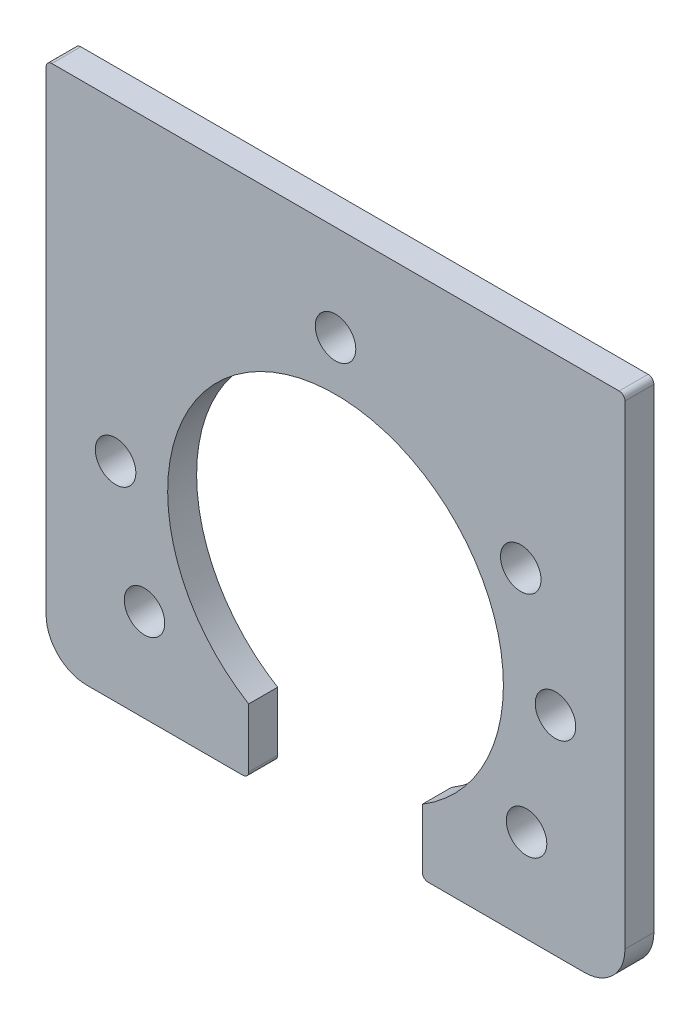
ISO-10303-21;
HEADER;
FILE_DESCRIPTION(('STEP AP214'),'2;1');
FILE_NAME('part.step','',(''),(''),'','','');
FILE_SCHEMA(('AUTOMOTIVE_DESIGN { 1 0 10303 214 1 1 1 1 }'));
ENDSEC;
DATA;
#1=APPLICATION_CONTEXT('core data for automotive mechanical design processes');
#2=APPLICATION_PROTOCOL_DEFINITION('international standard','automotive_design',2000,#1);
#3=PRODUCT_CONTEXT('',#1,'mechanical');
#4=PRODUCT('Part','Part','',(#3));
#5=PRODUCT_RELATED_PRODUCT_CATEGORY('part','',(#4));
#6=PRODUCT_DEFINITION_FORMATION('','',#4);
#7=PRODUCT_DEFINITION_CONTEXT('part definition',#1,'design');
#8=PRODUCT_DEFINITION('design','',#6,#7);
#9=PRODUCT_DEFINITION_SHAPE('','',#8);
#10=(LENGTH_UNIT() NAMED_UNIT(*) SI_UNIT(.MILLI.,.METRE.));
#11=(NAMED_UNIT(*) PLANE_ANGLE_UNIT() SI_UNIT($,.RADIAN.));
#12=(NAMED_UNIT(*) SI_UNIT($,.STERADIAN.) SOLID_ANGLE_UNIT());
#13=UNCERTAINTY_MEASURE_WITH_UNIT(LENGTH_MEASURE(1.E-05),#10,'distance_accuracy_value','');
#14=(GEOMETRIC_REPRESENTATION_CONTEXT(3) GLOBAL_UNCERTAINTY_ASSIGNED_CONTEXT((#13)) GLOBAL_UNIT_ASSIGNED_CONTEXT((#10,
#11,#12)) REPRESENTATION_CONTEXT('',''));
#15=CARTESIAN_POINT('',(0.,0.,0.));
#16=DIRECTION('',(0.,0.,1.));
#17=DIRECTION('',(1.,0.,0.));
#18=AXIS2_PLACEMENT_3D('',#15,#16,#17);
#19=CARTESIAN_POINT('',(-93.0000000000001,-83.0000000000001,5.));
#20=DIRECTION('',(0.,0.,-1.));
#21=DIRECTION('',(-1.,0.,0.));
#22=AXIS2_PLACEMENT_3D('',#19,#20,#21);
#23=PLANE('',#22);
#24=CARTESIAN_POINT('',(-83.0000000000002,-74.0000000000001,5.));
#25=DIRECTION('',(0.,0.,1.));
#26=DIRECTION('',(-1.,0.,0.));
#27=AXIS2_PLACEMENT_3D('',#24,#25,#26);
#28=CIRCLE('',#27,3.49999999999999);
#29=CARTESIAN_POINT('',(-86.5000000000002,-74.0000000000001,5.));
#30=VERTEX_POINT('',#29);
#31=EDGE_CURVE('E496',#30,#30,#28,.T.);
#32=ORIENTED_EDGE('',*,*,#31,.F.);
#33=EDGE_LOOP('',(#32));
#34=FACE_BOUND('',#33,.T.);
#35=CARTESIAN_POINT('',(-18.0000000000001,-35.,5.));
#36=DIRECTION('',(0.,0.,1.));
#37=DIRECTION('',(1.,0.,0.));
#38=AXIS2_PLACEMENT_3D('',#35,#36,#37);
#39=CIRCLE('',#38,3.5);
#40=CARTESIAN_POINT('',(-14.5000000000001,-35.,5.));
#41=VERTEX_POINT('',#40);
#42=EDGE_CURVE('E508',#41,#41,#39,.T.);
#43=ORIENTED_EDGE('',*,*,#42,.F.);
#44=EDGE_LOOP('',(#43));
#45=FACE_BOUND('',#44,.T.);
#46=CARTESIAN_POINT('',(-50.0000000000001,-16.5,5.));
#47=DIRECTION('',(0.,0.,1.));
#48=DIRECTION('',(1.,0.,0.));
#49=AXIS2_PLACEMENT_3D('',#46,#47,#48);
#50=CIRCLE('',#49,3.5);
#51=CARTESIAN_POINT('',(-46.5000000000001,-16.5,5.));
#52=VERTEX_POINT('',#51);
#53=EDGE_CURVE('E182',#52,#52,#50,.T.);
#54=ORIENTED_EDGE('',*,*,#53,.F.);
#55=EDGE_LOOP('',(#54));
#56=FACE_BOUND('',#55,.T.);
#57=DIRECTION('',(0.,-1.,0.));
#58=VECTOR('',#57,1.);
#59=CARTESIAN_POINT('',(-35.0000000000001,-78.8193472919817,5.));
#60=LINE('',#59,#58);
#61=CARTESIAN_POINT('',(-35.0000000000001,-78.8193472919817,5.));
#62=VERTEX_POINT('',#61);
#63=CARTESIAN_POINT('',(-35.0000000000001,-88.9999999999993,5.));
#64=VERTEX_POINT('',#63);
#65=EDGE_CURVE('E160',#62,#64,#60,.T.);
#66=ORIENTED_EDGE('',*,*,#65,.T.);
#67=CARTESIAN_POINT('',(-34.0000000000001,-88.9999999999993,5.));
#68=DIRECTION('',(0.,0.,-1.));
#69=DIRECTION('',(-1.,0.,0.));
#70=AXIS2_PLACEMENT_3D('',#67,#68,#69);
#71=CIRCLE('',#70,1.);
#72=CARTESIAN_POINT('',(-34.0000000000001,-90.,5.));
#73=VERTEX_POINT('',#72);
#74=EDGE_CURVE('E11',#64,#73,#71,.F.);
#75=ORIENTED_EDGE('',*,*,#74,.T.);
#76=DIRECTION('',(1.,0.,0.));
#77=VECTOR('',#76,1.);
#78=CARTESIAN_POINT('',(-35.0000000000001,-90.,5.));
#79=LINE('',#78,#77);
#80=CARTESIAN_POINT('',(-7.00000000000014,-90.0000000000001,5.));
#81=VERTEX_POINT('',#80);
#82=EDGE_CURVE('E162',#73,#81,#79,.T.);
#83=ORIENTED_EDGE('',*,*,#82,.T.);
#84=CARTESIAN_POINT('',(-7.00000000000009,-83.0000000000001,5.));
#85=DIRECTION('',(0.,0.,1.));
#86=DIRECTION('',(1.,0.,0.));
#87=AXIS2_PLACEMENT_3D('',#84,#85,#86);
#88=CIRCLE('',#87,7.00000000000001);
#89=CARTESIAN_POINT('',(0.,-83.,5.));
#90=VERTEX_POINT('',#89);
#91=EDGE_CURVE('E167',#81,#90,#88,.T.);
#92=ORIENTED_EDGE('',*,*,#91,.T.);
#93=DIRECTION('',(0.,1.,0.));
#94=VECTOR('',#93,1.);
#95=CARTESIAN_POINT('',(0.,-80.0000000000001,5.));
#96=LINE('',#95,#94);
#97=CARTESIAN_POINT('',(2.96059473233382E-13,-1.00000000000006,5.));
#98=VERTEX_POINT('',#97);
#99=EDGE_CURVE('E169',#90,#98,#96,.T.);
#100=ORIENTED_EDGE('',*,*,#99,.T.);
#101=CARTESIAN_POINT('',(-0.999999999999974,-1.00000000000006,5.));
#102=DIRECTION('',(0.,0.,-1.));
#103=DIRECTION('',(-1.,0.,0.));
#104=AXIS2_PLACEMENT_3D('',#101,#102,#103);
#105=CIRCLE('',#104,1.);
#106=CARTESIAN_POINT('',(-0.999999999999974,0.,5.));
#107=VERTEX_POINT('',#106);
#108=EDGE_CURVE('E232',#98,#107,#105,.F.);
#109=ORIENTED_EDGE('',*,*,#108,.T.);
#110=DIRECTION('',(-1.,0.,0.));
#111=VECTOR('',#110,1.);
#112=CARTESIAN_POINT('',(0.,0.,5.));
#113=LINE('',#112,#111);
#114=CARTESIAN_POINT('',(-99.0000000000005,0.,5.));
#115=VERTEX_POINT('',#114);
#116=EDGE_CURVE('E172',#107,#115,#113,.T.);
#117=ORIENTED_EDGE('',*,*,#116,.T.);
#118=CARTESIAN_POINT('',(-99.0000000000005,-1.00000000000006,5.));
#119=DIRECTION('',(0.,0.,-1.));
#120=DIRECTION('',(-1.,0.,0.));
#121=AXIS2_PLACEMENT_3D('',#118,#119,#120);
#122=CIRCLE('',#121,1.);
#123=CARTESIAN_POINT('',(-100.,-1.00000000000006,5.));
#124=VERTEX_POINT('',#123);
#125=EDGE_CURVE('E223',#115,#124,#122,.F.);
#126=ORIENTED_EDGE('',*,*,#125,.T.);
#127=DIRECTION('',(0.,-1.,0.));
#128=VECTOR('',#127,1.);
#129=CARTESIAN_POINT('',(-100.,0.,5.));
#130=LINE('',#129,#128);
#131=CARTESIAN_POINT('',(-100.,-83.,5.));
#132=VERTEX_POINT('',#131);
#133=EDGE_CURVE('E174',#124,#132,#130,.T.);
#134=ORIENTED_EDGE('',*,*,#133,.T.);
#135=CARTESIAN_POINT('',(-93.0000000000001,-83.0000000000001,5.));
#136=DIRECTION('',(0.,0.,1.));
#137=DIRECTION('',(-1.,0.,0.));
#138=AXIS2_PLACEMENT_3D('',#135,#136,#137);
#139=CIRCLE('',#138,7.00000000000001);
#140=CARTESIAN_POINT('',(-93.,-90.0000000000001,5.));
#141=VERTEX_POINT('',#140);
#142=EDGE_CURVE('E176',#132,#141,#139,.T.);
#143=ORIENTED_EDGE('',*,*,#142,.T.);
#144=DIRECTION('',(1.,0.,0.));
#145=VECTOR('',#144,1.);
#146=CARTESIAN_POINT('',(-65.0000000000001,-90.,5.));
#147=LINE('',#146,#145);
#148=CARTESIAN_POINT('',(-66.0000000000001,-90.,5.));
#149=VERTEX_POINT('',#148);
#150=EDGE_CURVE('E146',#141,#149,#147,.T.);
#151=ORIENTED_EDGE('',*,*,#150,.T.);
#152=CARTESIAN_POINT('',(-66.0000000000001,-88.9999999999993,5.));
#153=DIRECTION('',(0.,0.,-1.));
#154=DIRECTION('',(-1.,0.,0.));
#155=AXIS2_PLACEMENT_3D('',#152,#153,#154);
#156=CIRCLE('',#155,1.);
#157=CARTESIAN_POINT('',(-65.0000000000001,-88.9999999999993,5.));
#158=VERTEX_POINT('',#157);
#159=EDGE_CURVE('E142',#149,#158,#156,.F.);
#160=ORIENTED_EDGE('',*,*,#159,.T.);
#161=DIRECTION('',(0.,1.,0.));
#162=VECTOR('',#161,1.);
#163=CARTESIAN_POINT('',(-65.0000000000001,-78.8193472919817,5.));
#164=LINE('',#163,#162);
#165=CARTESIAN_POINT('',(-65.0000000000001,-78.8193472919817,5.));
#166=VERTEX_POINT('',#165);
#167=EDGE_CURVE('E134',#158,#166,#164,.T.);
#168=ORIENTED_EDGE('',*,*,#167,.T.);
#169=CARTESIAN_POINT('',(-50.0000000000001,-54.,5.));
#170=DIRECTION('',(0.,0.,-1.));
#171=DIRECTION('',(1.,0.,0.));
#172=AXIS2_PLACEMENT_3D('',#169,#170,#171);
#173=CIRCLE('',#172,29.);
#174=EDGE_CURVE('E138',#166,#62,#173,.T.);
#175=ORIENTED_EDGE('',*,*,#174,.T.);
#176=EDGE_LOOP('',(#66,#75,#83,#92,#100,#109,#117,#126,#134,#143,#151,#160,#168,#175));
#177=FACE_BOUND('',#176,.T.);
#178=CARTESIAN_POINT('',(-12.,-54.,5.));
#179=DIRECTION('',(0.,0.,1.));
#180=DIRECTION('',(1.,0.,0.));
#181=AXIS2_PLACEMENT_3D('',#178,#179,#180);
#182=CIRCLE('',#181,3.5);
#183=CARTESIAN_POINT('',(-8.49999999999996,-54.,5.));
#184=VERTEX_POINT('',#183);
#185=EDGE_CURVE('E514',#184,#184,#182,.T.);
#186=ORIENTED_EDGE('',*,*,#185,.F.);
#187=EDGE_LOOP('',(#186));
#188=FACE_BOUND('',#187,.T.);
#189=CARTESIAN_POINT('',(-17.,-74.0000000000001,5.));
#190=DIRECTION('',(0.,0.,1.));
#191=DIRECTION('',(1.,0.,0.));
#192=AXIS2_PLACEMENT_3D('',#189,#190,#191);
#193=CIRCLE('',#192,3.5);
#194=CARTESIAN_POINT('',(-13.5,-74.0000000000001,5.));
#195=VERTEX_POINT('',#194);
#196=EDGE_CURVE('E502',#195,#195,#193,.T.);
#197=ORIENTED_EDGE('',*,*,#196,.F.);
#198=EDGE_LOOP('',(#197));
#199=FACE_BOUND('',#198,.T.);
#200=CARTESIAN_POINT('',(-88.0000000000002,-54.,5.));
#201=DIRECTION('',(0.,0.,1.));
#202=DIRECTION('',(-1.,0.,0.));
#203=AXIS2_PLACEMENT_3D('',#200,#201,#202);
#204=CIRCLE('',#203,3.50000000000001);
#205=CARTESIAN_POINT('',(-91.5000000000002,-54.,5.));
#206=VERTEX_POINT('',#205);
#207=EDGE_CURVE('E487',#206,#206,#204,.T.);
#208=ORIENTED_EDGE('',*,*,#207,.F.);
#209=EDGE_LOOP('',(#208));
#210=FACE_BOUND('',#209,.T.);
#211=ADVANCED_FACE('F34',(#34,#45,#56,#177,#188,#199,#210),#23,.F.);
#212=CARTESIAN_POINT('',(-93.0000000000001,-83.0000000000001,0.));
#213=DIRECTION('',(0.,0.,-1.));
#214=DIRECTION('',(-1.,0.,0.));
#215=AXIS2_PLACEMENT_3D('',#212,#213,#214);
#216=PLANE('',#215);
#217=CARTESIAN_POINT('',(-83.0000000000002,-74.0000000000001,0.));
#218=DIRECTION('',(0.,0.,1.));
#219=DIRECTION('',(-1.,0.,0.));
#220=AXIS2_PLACEMENT_3D('',#217,#218,#219);
#221=CIRCLE('',#220,3.49999999999999);
#222=CARTESIAN_POINT('',(-86.5000000000002,-74.0000000000001,0.));
#223=VERTEX_POINT('',#222);
#224=EDGE_CURVE('E493',#223,#223,#221,.T.);
#225=ORIENTED_EDGE('',*,*,#224,.T.);
#226=EDGE_LOOP('',(#225));
#227=FACE_BOUND('',#226,.T.);
#228=CARTESIAN_POINT('',(-18.0000000000001,-35.,0.));
#229=DIRECTION('',(0.,0.,1.));
#230=DIRECTION('',(1.,0.,0.));
#231=AXIS2_PLACEMENT_3D('',#228,#229,#230);
#232=CIRCLE('',#231,3.5);
#233=CARTESIAN_POINT('',(-14.5000000000001,-35.,0.));
#234=VERTEX_POINT('',#233);
#235=EDGE_CURVE('E505',#234,#234,#232,.T.);
#236=ORIENTED_EDGE('',*,*,#235,.T.);
#237=EDGE_LOOP('',(#236));
#238=FACE_BOUND('',#237,.T.);
#239=CARTESIAN_POINT('',(-50.0000000000001,-16.5,0.));
#240=DIRECTION('',(0.,0.,1.));
#241=DIRECTION('',(1.,0.,0.));
#242=AXIS2_PLACEMENT_3D('',#239,#240,#241);
#243=CIRCLE('',#242,3.5);
#244=CARTESIAN_POINT('',(-46.5000000000001,-16.5,0.));
#245=VERTEX_POINT('',#244);
#246=EDGE_CURVE('E517',#245,#245,#243,.T.);
#247=ORIENTED_EDGE('',*,*,#246,.T.);
#248=EDGE_LOOP('',(#247));
#249=FACE_BOUND('',#248,.T.);
#250=DIRECTION('',(1.,0.,0.));
#251=VECTOR('',#250,1.);
#252=CARTESIAN_POINT('',(-8.00000000000008,-90.,0.));
#253=LINE('',#252,#251);
#254=CARTESIAN_POINT('',(-34.0000000000001,-89.9999999999993,0.));
#255=VERTEX_POINT('',#254);
#256=CARTESIAN_POINT('',(-7.00000000000014,-90.0000000000001,0.));
#257=VERTEX_POINT('',#256);
#258=EDGE_CURVE('E186',#255,#257,#253,.T.);
#259=ORIENTED_EDGE('',*,*,#258,.F.);
#260=CARTESIAN_POINT('',(-34.0000000000001,-88.9999999999993,0.));
#261=DIRECTION('',(0.,0.,-1.));
#262=DIRECTION('',(-1.,0.,0.));
#263=AXIS2_PLACEMENT_3D('',#260,#261,#262);
#264=CIRCLE('',#263,1.);
#265=CARTESIAN_POINT('',(-35.0000000000001,-88.9999999999993,0.));
#266=VERTEX_POINT('',#265);
#267=EDGE_CURVE('E56',#255,#266,#264,.T.);
#268=ORIENTED_EDGE('',*,*,#267,.T.);
#269=DIRECTION('',(0.,-1.,0.));
#270=VECTOR('',#269,1.);
#271=CARTESIAN_POINT('',(-35.0000000000001,-78.8193472919817,0.));
#272=LINE('',#271,#270);
#273=CARTESIAN_POINT('',(-35.0000000000001,-78.8193472919817,0.));
#274=VERTEX_POINT('',#273);
#275=EDGE_CURVE('E184',#274,#266,#272,.T.);
#276=ORIENTED_EDGE('',*,*,#275,.F.);
#277=CARTESIAN_POINT('',(-50.0000000000001,-54.,0.));
#278=DIRECTION('',(0.,0.,-1.));
#279=DIRECTION('',(1.,0.,0.));
#280=AXIS2_PLACEMENT_3D('',#277,#278,#279);
#281=CIRCLE('',#280,29.);
#282=CARTESIAN_POINT('',(-65.0000000000001,-78.8193472919817,0.));
#283=VERTEX_POINT('',#282);
#284=EDGE_CURVE('E181',#283,#274,#281,.T.);
#285=ORIENTED_EDGE('',*,*,#284,.F.);
#286=DIRECTION('',(0.,1.,0.));
#287=VECTOR('',#286,1.);
#288=CARTESIAN_POINT('',(-65.0000000000001,-78.8193472919817,0.));
#289=LINE('',#288,#287);
#290=CARTESIAN_POINT('',(-65.0000000000001,-88.9999999999993,0.));
#291=VERTEX_POINT('',#290);
#292=EDGE_CURVE('E152',#291,#283,#289,.T.);
#293=ORIENTED_EDGE('',*,*,#292,.F.);
#294=CARTESIAN_POINT('',(-66.0000000000001,-88.9999999999993,0.));
#295=DIRECTION('',(0.,0.,-1.));
#296=DIRECTION('',(-1.,0.,0.));
#297=AXIS2_PLACEMENT_3D('',#294,#295,#296);
#298=CIRCLE('',#297,1.);
#299=CARTESIAN_POINT('',(-66.0000000000001,-89.9999999999993,0.));
#300=VERTEX_POINT('',#299);
#301=EDGE_CURVE('E236',#291,#300,#298,.T.);
#302=ORIENTED_EDGE('',*,*,#301,.T.);
#303=DIRECTION('',(1.,0.,0.));
#304=VECTOR('',#303,1.);
#305=CARTESIAN_POINT('',(-92.0000000000001,-90.,0.));
#306=LINE('',#305,#304);
#307=CARTESIAN_POINT('',(-93.,-90.0000000000001,0.));
#308=VERTEX_POINT('',#307);
#309=EDGE_CURVE('E200',#308,#300,#306,.T.);
#310=ORIENTED_EDGE('',*,*,#309,.F.);
#311=CARTESIAN_POINT('',(-93.0000000000001,-83.0000000000001,0.));
#312=DIRECTION('',(0.,0.,1.));
#313=DIRECTION('',(-1.,0.,0.));
#314=AXIS2_PLACEMENT_3D('',#311,#312,#313);
#315=CIRCLE('',#314,7.00000000000001);
#316=CARTESIAN_POINT('',(-100.,-83.,0.));
#317=VERTEX_POINT('',#316);
#318=EDGE_CURVE('E198',#317,#308,#315,.T.);
#319=ORIENTED_EDGE('',*,*,#318,.F.);
#320=DIRECTION('',(0.,-1.,0.));
#321=VECTOR('',#320,1.);
#322=CARTESIAN_POINT('',(-100.,-80.0000000000001,0.));
#323=LINE('',#322,#321);
#324=CARTESIAN_POINT('',(-100.,-1.00000000000006,0.));
#325=VERTEX_POINT('',#324);
#326=EDGE_CURVE('E196',#325,#317,#323,.T.);
#327=ORIENTED_EDGE('',*,*,#326,.F.);
#328=CARTESIAN_POINT('',(-99.0000000000005,-1.00000000000006,0.));
#329=DIRECTION('',(0.,0.,-1.));
#330=DIRECTION('',(-1.,0.,0.));
#331=AXIS2_PLACEMENT_3D('',#328,#329,#330);
#332=CIRCLE('',#331,1.);
#333=CARTESIAN_POINT('',(-99.0000000000005,0.,0.));
#334=VERTEX_POINT('',#333);
#335=EDGE_CURVE('E217',#325,#334,#332,.T.);
#336=ORIENTED_EDGE('',*,*,#335,.T.);
#337=DIRECTION('',(-1.,0.,0.));
#338=VECTOR('',#337,1.);
#339=CARTESIAN_POINT('',(0.,0.,0.));
#340=LINE('',#339,#338);
#341=CARTESIAN_POINT('',(-0.999999999999974,0.,0.));
#342=VERTEX_POINT('',#341);
#343=EDGE_CURVE('E194',#342,#334,#340,.T.);
#344=ORIENTED_EDGE('',*,*,#343,.F.);
#345=CARTESIAN_POINT('',(-0.999999999999974,-1.00000000000006,0.));
#346=DIRECTION('',(0.,0.,-1.));
#347=DIRECTION('',(-1.,0.,0.));
#348=AXIS2_PLACEMENT_3D('',#345,#346,#347);
#349=CIRCLE('',#348,1.);
#350=CARTESIAN_POINT('',(0.,-1.00000000000006,0.));
#351=VERTEX_POINT('',#350);
#352=EDGE_CURVE('E228',#342,#351,#349,.T.);
#353=ORIENTED_EDGE('',*,*,#352,.T.);
#354=DIRECTION('',(0.,1.,0.));
#355=VECTOR('',#354,1.);
#356=CARTESIAN_POINT('',(0.,0.,0.));
#357=LINE('',#356,#355);
#358=CARTESIAN_POINT('',(0.,-83.,0.));
#359=VERTEX_POINT('',#358);
#360=EDGE_CURVE('E191',#359,#351,#357,.T.);
#361=ORIENTED_EDGE('',*,*,#360,.F.);
#362=CARTESIAN_POINT('',(-7.00000000000009,-83.0000000000001,0.));
#363=DIRECTION('',(0.,0.,1.));
#364=DIRECTION('',(1.,0.,0.));
#365=AXIS2_PLACEMENT_3D('',#362,#363,#364);
#366=CIRCLE('',#365,7.00000000000001);
#367=EDGE_CURVE('E188',#257,#359,#366,.T.);
#368=ORIENTED_EDGE('',*,*,#367,.F.);
#369=EDGE_LOOP('',(#259,#268,#276,#285,#293,#302,#310,#319,#327,#336,#344,#353,#361,#368));
#370=FACE_BOUND('',#369,.T.);
#371=CARTESIAN_POINT('',(-12.,-54.,0.));
#372=DIRECTION('',(0.,0.,1.));
#373=DIRECTION('',(1.,0.,0.));
#374=AXIS2_PLACEMENT_3D('',#371,#372,#373);
#375=CIRCLE('',#374,3.5);
#376=CARTESIAN_POINT('',(-8.49999999999996,-54.,0.));
#377=VERTEX_POINT('',#376);
#378=EDGE_CURVE('E511',#377,#377,#375,.T.);
#379=ORIENTED_EDGE('',*,*,#378,.T.);
#380=EDGE_LOOP('',(#379));
#381=FACE_BOUND('',#380,.T.);
#382=CARTESIAN_POINT('',(-17.,-74.0000000000001,0.));
#383=DIRECTION('',(0.,0.,1.));
#384=DIRECTION('',(1.,0.,0.));
#385=AXIS2_PLACEMENT_3D('',#382,#383,#384);
#386=CIRCLE('',#385,3.5);
#387=CARTESIAN_POINT('',(-13.5,-74.0000000000001,0.));
#388=VERTEX_POINT('',#387);
#389=EDGE_CURVE('E499',#388,#388,#386,.T.);
#390=ORIENTED_EDGE('',*,*,#389,.T.);
#391=EDGE_LOOP('',(#390));
#392=FACE_BOUND('',#391,.T.);
#393=CARTESIAN_POINT('',(-88.0000000000002,-54.,0.));
#394=DIRECTION('',(0.,0.,1.));
#395=DIRECTION('',(-1.,0.,0.));
#396=AXIS2_PLACEMENT_3D('',#393,#394,#395);
#397=CIRCLE('',#396,3.50000000000001);
#398=CARTESIAN_POINT('',(-91.5000000000002,-54.,0.));
#399=VERTEX_POINT('',#398);
#400=EDGE_CURVE('E490',#399,#399,#397,.T.);
#401=ORIENTED_EDGE('',*,*,#400,.T.);
#402=EDGE_LOOP('',(#401));
#403=FACE_BOUND('',#402,.T.);
#404=ADVANCED_FACE('F252',(#227,#238,#249,#370,#381,#392,#403),#216,.T.);
#405=CARTESIAN_POINT('',(-65.0000000000001,-78.8193472919817,5.));
#406=DIRECTION('',(-1.,0.,0.));
#407=DIRECTION('',(0.,0.,1.));
#408=AXIS2_PLACEMENT_3D('',#405,#406,#407);
#409=PLANE('',#408);
#410=ORIENTED_EDGE('',*,*,#167,.F.);
#411=DIRECTION('',(0.,0.,-1.));
#412=VECTOR('',#411,1.);
#413=CARTESIAN_POINT('',(-65.0000000000001,-88.9999999999993,5.));
#414=LINE('',#413,#412);
#415=EDGE_CURVE('E234',#158,#291,#414,.T.);
#416=ORIENTED_EDGE('',*,*,#415,.T.);
#417=ORIENTED_EDGE('',*,*,#292,.T.);
#418=DIRECTION('',(0.,0.,-1.));
#419=VECTOR('',#418,1.);
#420=CARTESIAN_POINT('',(-65.0000000000001,-78.8193472919817,5.));
#421=LINE('',#420,#419);
#422=EDGE_CURVE('E149',#166,#283,#421,.T.);
#423=ORIENTED_EDGE('',*,*,#422,.F.);
#424=EDGE_LOOP('',(#410,#416,#417,#423));
#425=FACE_BOUND('',#424,.T.);
#426=ADVANCED_FACE('F150',(#425),#409,.F.);
#427=CARTESIAN_POINT('',(-50.0000000000001,-54.,5.));
#428=DIRECTION('',(0.,0.,-1.));
#429=DIRECTION('',(-1.,0.,0.));
#430=AXIS2_PLACEMENT_3D('',#427,#428,#429);
#431=CYLINDRICAL_SURFACE('',#430,29.);
#432=ORIENTED_EDGE('',*,*,#284,.T.);
#433=DIRECTION('',(0.,0.,-1.));
#434=VECTOR('',#433,1.);
#435=CARTESIAN_POINT('',(-35.0000000000001,-78.8193472919817,5.));
#436=LINE('',#435,#434);
#437=EDGE_CURVE('E156',#62,#274,#436,.T.);
#438=ORIENTED_EDGE('',*,*,#437,.F.);
#439=ORIENTED_EDGE('',*,*,#174,.F.);
#440=ORIENTED_EDGE('',*,*,#422,.T.);
#441=EDGE_LOOP('',(#432,#438,#439,#440));
#442=FACE_BOUND('',#441,.T.);
#443=ADVANCED_FACE('F158',(#442),#431,.F.);
#444=CARTESIAN_POINT('',(-35.0000000000001,-78.8193472919817,5.));
#445=DIRECTION('',(1.,0.,0.));
#446=DIRECTION('',(0.,1.,0.));
#447=AXIS2_PLACEMENT_3D('',#444,#445,#446);
#448=PLANE('',#447);
#449=ORIENTED_EDGE('',*,*,#275,.T.);
#450=DIRECTION('',(0.,0.,-1.));
#451=VECTOR('',#450,1.);
#452=CARTESIAN_POINT('',(-35.0000000000001,-88.9999999999993,5.));
#453=LINE('',#452,#451);
#454=EDGE_CURVE('E42',#266,#64,#453,.F.);
#455=ORIENTED_EDGE('',*,*,#454,.T.);
#456=ORIENTED_EDGE('',*,*,#65,.F.);
#457=ORIENTED_EDGE('',*,*,#437,.T.);
#458=EDGE_LOOP('',(#449,#455,#456,#457));
#459=FACE_BOUND('',#458,.T.);
#460=ADVANCED_FACE('F290',(#459),#448,.F.);
#461=CARTESIAN_POINT('',(-8.00000000000008,-90.,5.));
#462=DIRECTION('',(0.,1.,0.));
#463=DIRECTION('',(-1.,0.,0.));
#464=AXIS2_PLACEMENT_3D('',#461,#462,#463);
#465=PLANE('',#464);
#466=ORIENTED_EDGE('',*,*,#82,.F.);
#467=DIRECTION('',(0.,0.,-1.));
#468=VECTOR('',#467,1.);
#469=CARTESIAN_POINT('',(-34.0000000000001,-89.9999999999993,5.));
#470=LINE('',#469,#468);
#471=EDGE_CURVE('E241',#73,#255,#470,.T.);
#472=ORIENTED_EDGE('',*,*,#471,.T.);
#473=ORIENTED_EDGE('',*,*,#258,.T.);
#474=DIRECTION('',(0.,0.,-1.));
#475=VECTOR('',#474,1.);
#476=CARTESIAN_POINT('',(-7.00000000000014,-90.0000000000001,5.));
#477=LINE('',#476,#475);
#478=EDGE_CURVE('E211',#81,#257,#477,.T.);
#479=ORIENTED_EDGE('',*,*,#478,.F.);
#480=EDGE_LOOP('',(#466,#472,#473,#479));
#481=FACE_BOUND('',#480,.T.);
#482=ADVANCED_FACE('F247',(#481),#465,.F.);
#483=CARTESIAN_POINT('',(-7.00000000000009,-83.0000000000001,5.));
#484=DIRECTION('',(0.,0.,-1.));
#485=DIRECTION('',(-1.,0.,0.));
#486=AXIS2_PLACEMENT_3D('',#483,#484,#485);
#487=CYLINDRICAL_SURFACE('',#486,7.00000000000001);
#488=ORIENTED_EDGE('',*,*,#367,.T.);
#489=DIRECTION('',(0.,0.,-1.));
#490=VECTOR('',#489,1.);
#491=CARTESIAN_POINT('',(0.,-83.,5.));
#492=LINE('',#491,#490);
#493=EDGE_CURVE('E208',#90,#359,#492,.T.);
#494=ORIENTED_EDGE('',*,*,#493,.F.);
#495=ORIENTED_EDGE('',*,*,#91,.F.);
#496=ORIENTED_EDGE('',*,*,#478,.T.);
#497=EDGE_LOOP('',(#488,#494,#495,#496));
#498=FACE_BOUND('',#497,.T.);
#499=ADVANCED_FACE('F256',(#498),#487,.T.);
#500=CARTESIAN_POINT('',(0.,0.,5.));
#501=DIRECTION('',(-1.,0.,0.));
#502=DIRECTION('',(0.,-1.,0.));
#503=AXIS2_PLACEMENT_3D('',#500,#501,#502);
#504=PLANE('',#503);
#505=ORIENTED_EDGE('',*,*,#360,.T.);
#506=DIRECTION('',(0.,0.,-1.));
#507=VECTOR('',#506,1.);
#508=CARTESIAN_POINT('',(0.,-1.00000000000006,5.));
#509=LINE('',#508,#507);
#510=EDGE_CURVE('E230',#351,#98,#509,.F.);
#511=ORIENTED_EDGE('',*,*,#510,.T.);
#512=ORIENTED_EDGE('',*,*,#99,.F.);
#513=ORIENTED_EDGE('',*,*,#493,.T.);
#514=EDGE_LOOP('',(#505,#511,#512,#513));
#515=FACE_BOUND('',#514,.T.);
#516=ADVANCED_FACE('F260',(#515),#504,.F.);
#517=CARTESIAN_POINT('',(0.,0.,5.));
#518=DIRECTION('',(0.,-1.,0.));
#519=DIRECTION('',(0.,0.,-1.));
#520=AXIS2_PLACEMENT_3D('',#517,#518,#519);
#521=PLANE('',#520);
#522=ORIENTED_EDGE('',*,*,#116,.F.);
#523=DIRECTION('',(0.,0.,-1.));
#524=VECTOR('',#523,1.);
#525=CARTESIAN_POINT('',(-0.999999999999974,0.,5.));
#526=LINE('',#525,#524);
#527=EDGE_CURVE('E225',#107,#342,#526,.T.);
#528=ORIENTED_EDGE('',*,*,#527,.T.);
#529=ORIENTED_EDGE('',*,*,#343,.T.);
#530=DIRECTION('',(0.,0.,-1.));
#531=VECTOR('',#530,1.);
#532=CARTESIAN_POINT('',(-99.0000000000005,0.,5.));
#533=LINE('',#532,#531);
#534=EDGE_CURVE('E220',#334,#115,#533,.F.);
#535=ORIENTED_EDGE('',*,*,#534,.T.);
#536=EDGE_LOOP('',(#522,#528,#529,#535));
#537=FACE_BOUND('',#536,.T.);
#538=ADVANCED_FACE('F269',(#537),#521,.F.);
#539=CARTESIAN_POINT('',(-100.,-80.0000000000001,5.));
#540=DIRECTION('',(1.,0.,0.));
#541=DIRECTION('',(0.,1.,0.));
#542=AXIS2_PLACEMENT_3D('',#539,#540,#541);
#543=PLANE('',#542);
#544=ORIENTED_EDGE('',*,*,#133,.F.);
#545=DIRECTION('',(0.,0.,-1.));
#546=VECTOR('',#545,1.);
#547=CARTESIAN_POINT('',(-100.,-1.00000000000006,5.));
#548=LINE('',#547,#546);
#549=EDGE_CURVE('E155',#124,#325,#548,.T.);
#550=ORIENTED_EDGE('',*,*,#549,.T.);
#551=ORIENTED_EDGE('',*,*,#326,.T.);
#552=DIRECTION('',(0.,0.,-1.));
#553=VECTOR('',#552,1.);
#554=CARTESIAN_POINT('',(-100.,-83.,5.));
#555=LINE('',#554,#553);
#556=EDGE_CURVE('E205',#132,#317,#555,.T.);
#557=ORIENTED_EDGE('',*,*,#556,.F.);
#558=EDGE_LOOP('',(#544,#550,#551,#557));
#559=FACE_BOUND('',#558,.T.);
#560=ADVANCED_FACE('F280',(#559),#543,.F.);
#561=CARTESIAN_POINT('',(-93.0000000000001,-83.0000000000001,5.));
#562=DIRECTION('',(0.,0.,-1.));
#563=DIRECTION('',(-1.,0.,0.));
#564=AXIS2_PLACEMENT_3D('',#561,#562,#563);
#565=CYLINDRICAL_SURFACE('',#564,7.00000000000001);
#566=ORIENTED_EDGE('',*,*,#318,.T.);
#567=DIRECTION('',(0.,0.,-1.));
#568=VECTOR('',#567,1.);
#569=CARTESIAN_POINT('',(-93.,-90.0000000000001,5.));
#570=LINE('',#569,#568);
#571=EDGE_CURVE('E179',#141,#308,#570,.T.);
#572=ORIENTED_EDGE('',*,*,#571,.F.);
#573=ORIENTED_EDGE('',*,*,#142,.F.);
#574=ORIENTED_EDGE('',*,*,#556,.T.);
#575=EDGE_LOOP('',(#566,#572,#573,#574));
#576=FACE_BOUND('',#575,.T.);
#577=ADVANCED_FACE('F284',(#576),#565,.T.);
#578=CARTESIAN_POINT('',(-92.0000000000001,-90.,5.));
#579=DIRECTION('',(0.,1.,0.));
#580=DIRECTION('',(-1.,0.,0.));
#581=AXIS2_PLACEMENT_3D('',#578,#579,#580);
#582=PLANE('',#581);
#583=ORIENTED_EDGE('',*,*,#309,.T.);
#584=DIRECTION('',(0.,0.,-1.));
#585=VECTOR('',#584,1.);
#586=CARTESIAN_POINT('',(-66.0000000000001,-89.9999999999993,5.));
#587=LINE('',#586,#585);
#588=EDGE_CURVE('E238',#300,#149,#587,.F.);
#589=ORIENTED_EDGE('',*,*,#588,.T.);
#590=ORIENTED_EDGE('',*,*,#150,.F.);
#591=ORIENTED_EDGE('',*,*,#571,.T.);
#592=EDGE_LOOP('',(#583,#589,#590,#591));
#593=FACE_BOUND('',#592,.T.);
#594=ADVANCED_FACE('F309',(#593),#582,.F.);
#595=CARTESIAN_POINT('',(-50.0000000000001,-16.5,5.));
#596=DIRECTION('',(0.,0.,-1.));
#597=DIRECTION('',(-1.,0.,0.));
#598=AXIS2_PLACEMENT_3D('',#595,#596,#597);
#599=CYLINDRICAL_SURFACE('',#598,3.5);
#600=ORIENTED_EDGE('',*,*,#53,.T.);
#601=EDGE_LOOP('',(#600));
#602=FACE_BOUND('',#601,.T.);
#603=ORIENTED_EDGE('',*,*,#246,.F.);
#604=EDGE_LOOP('',(#603));
#605=FACE_BOUND('',#604,.T.);
#606=ADVANCED_FACE('F306',(#602,#605),#599,.F.);
#607=CARTESIAN_POINT('',(-12.,-54.,5.));
#608=DIRECTION('',(0.,0.,-1.));
#609=DIRECTION('',(-1.,0.,0.));
#610=AXIS2_PLACEMENT_3D('',#607,#608,#609);
#611=CYLINDRICAL_SURFACE('',#610,3.5);
#612=ORIENTED_EDGE('',*,*,#185,.T.);
#613=EDGE_LOOP('',(#612));
#614=FACE_BOUND('',#613,.T.);
#615=ORIENTED_EDGE('',*,*,#378,.F.);
#616=EDGE_LOOP('',(#615));
#617=FACE_BOUND('',#616,.T.);
#618=ADVANCED_FACE('F407',(#614,#617),#611,.F.);
#619=CARTESIAN_POINT('',(-18.0000000000001,-35.,5.));
#620=DIRECTION('',(0.,0.,-1.));
#621=DIRECTION('',(-1.,0.,0.));
#622=AXIS2_PLACEMENT_3D('',#619,#620,#621);
#623=CYLINDRICAL_SURFACE('',#622,3.5);
#624=ORIENTED_EDGE('',*,*,#42,.T.);
#625=EDGE_LOOP('',(#624));
#626=FACE_BOUND('',#625,.T.);
#627=ORIENTED_EDGE('',*,*,#235,.F.);
#628=EDGE_LOOP('',(#627));
#629=FACE_BOUND('',#628,.T.);
#630=ADVANCED_FACE('F414',(#626,#629),#623,.F.);
#631=CARTESIAN_POINT('',(-17.,-74.0000000000001,5.));
#632=DIRECTION('',(0.,0.,-1.));
#633=DIRECTION('',(-1.,0.,0.));
#634=AXIS2_PLACEMENT_3D('',#631,#632,#633);
#635=CYLINDRICAL_SURFACE('',#634,3.5);
#636=ORIENTED_EDGE('',*,*,#196,.T.);
#637=EDGE_LOOP('',(#636));
#638=FACE_BOUND('',#637,.T.);
#639=ORIENTED_EDGE('',*,*,#389,.F.);
#640=EDGE_LOOP('',(#639));
#641=FACE_BOUND('',#640,.T.);
#642=ADVANCED_FACE('F421',(#638,#641),#635,.F.);
#643=CARTESIAN_POINT('',(-83.0000000000002,-74.0000000000001,5.));
#644=DIRECTION('',(0.,0.,-1.));
#645=DIRECTION('',(-1.,0.,0.));
#646=AXIS2_PLACEMENT_3D('',#643,#644,#645);
#647=CYLINDRICAL_SURFACE('',#646,3.49999999999999);
#648=ORIENTED_EDGE('',*,*,#31,.T.);
#649=EDGE_LOOP('',(#648));
#650=FACE_BOUND('',#649,.T.);
#651=ORIENTED_EDGE('',*,*,#224,.F.);
#652=EDGE_LOOP('',(#651));
#653=FACE_BOUND('',#652,.T.);
#654=ADVANCED_FACE('F429',(#650,#653),#647,.F.);
#655=CARTESIAN_POINT('',(-88.0000000000002,-54.,5.));
#656=DIRECTION('',(0.,0.,-1.));
#657=DIRECTION('',(-1.,0.,0.));
#658=AXIS2_PLACEMENT_3D('',#655,#656,#657);
#659=CYLINDRICAL_SURFACE('',#658,3.50000000000001);
#660=ORIENTED_EDGE('',*,*,#207,.T.);
#661=EDGE_LOOP('',(#660));
#662=FACE_BOUND('',#661,.T.);
#663=ORIENTED_EDGE('',*,*,#400,.F.);
#664=EDGE_LOOP('',(#663));
#665=FACE_BOUND('',#664,.T.);
#666=ADVANCED_FACE('F332',(#662,#665),#659,.F.);
#667=CARTESIAN_POINT('',(-99.0000000000005,-1.00000000000006,5.));
#668=DIRECTION('',(0.,0.,-1.));
#669=DIRECTION('',(-1.,0.,0.));
#670=AXIS2_PLACEMENT_3D('',#667,#668,#669);
#671=CYLINDRICAL_SURFACE('',#670,1.);
#672=ORIENTED_EDGE('',*,*,#125,.F.);
#673=ORIENTED_EDGE('',*,*,#534,.F.);
#674=ORIENTED_EDGE('',*,*,#335,.F.);
#675=ORIENTED_EDGE('',*,*,#549,.F.);
#676=EDGE_LOOP('',(#672,#673,#674,#675));
#677=FACE_BOUND('',#676,.T.);
#678=ADVANCED_FACE('F276',(#677),#671,.T.);
#679=CARTESIAN_POINT('',(-0.999999999999974,-1.00000000000006,5.));
#680=DIRECTION('',(0.,0.,-1.));
#681=DIRECTION('',(-1.,0.,0.));
#682=AXIS2_PLACEMENT_3D('',#679,#680,#681);
#683=CYLINDRICAL_SURFACE('',#682,1.);
#684=ORIENTED_EDGE('',*,*,#108,.F.);
#685=ORIENTED_EDGE('',*,*,#510,.F.);
#686=ORIENTED_EDGE('',*,*,#352,.F.);
#687=ORIENTED_EDGE('',*,*,#527,.F.);
#688=EDGE_LOOP('',(#684,#685,#686,#687));
#689=FACE_BOUND('',#688,.T.);
#690=ADVANCED_FACE('F266',(#689),#683,.T.);
#691=CARTESIAN_POINT('',(-66.0000000000001,-88.9999999999993,5.));
#692=DIRECTION('',(0.,0.,-1.));
#693=DIRECTION('',(-1.,0.,0.));
#694=AXIS2_PLACEMENT_3D('',#691,#692,#693);
#695=CYLINDRICAL_SURFACE('',#694,1.);
#696=ORIENTED_EDGE('',*,*,#159,.F.);
#697=ORIENTED_EDGE('',*,*,#588,.F.);
#698=ORIENTED_EDGE('',*,*,#301,.F.);
#699=ORIENTED_EDGE('',*,*,#415,.F.);
#700=EDGE_LOOP('',(#696,#697,#698,#699));
#701=FACE_BOUND('',#700,.T.);
#702=ADVANCED_FACE('F288',(#701),#695,.T.);
#703=CARTESIAN_POINT('',(-34.0000000000001,-88.9999999999993,5.));
#704=DIRECTION('',(0.,0.,-1.));
#705=DIRECTION('',(-1.,0.,0.));
#706=AXIS2_PLACEMENT_3D('',#703,#704,#705);
#707=CYLINDRICAL_SURFACE('',#706,1.);
#708=ORIENTED_EDGE('',*,*,#74,.F.);
#709=ORIENTED_EDGE('',*,*,#454,.F.);
#710=ORIENTED_EDGE('',*,*,#267,.F.);
#711=ORIENTED_EDGE('',*,*,#471,.F.);
#712=EDGE_LOOP('',(#708,#709,#710,#711));
#713=FACE_BOUND('',#712,.T.);
#714=ADVANCED_FACE('F36',(#713),#707,.T.);
#715=CLOSED_SHELL('',(#211,#404,#426,#443,#460,#482,#499,#516,#538,#560,#577,#594,#606,#618,
#630,#642,#654,#666,#678,#690,#702,#714));
#716=MANIFOLD_SOLID_BREP('B2',#715);
#717=ADVANCED_BREP_SHAPE_REPRESENTATION('',(#18,#716),#14);
#718=SHAPE_DEFINITION_REPRESENTATION(#9,#717);
ENDSEC;
END-ISO-10303-21;
